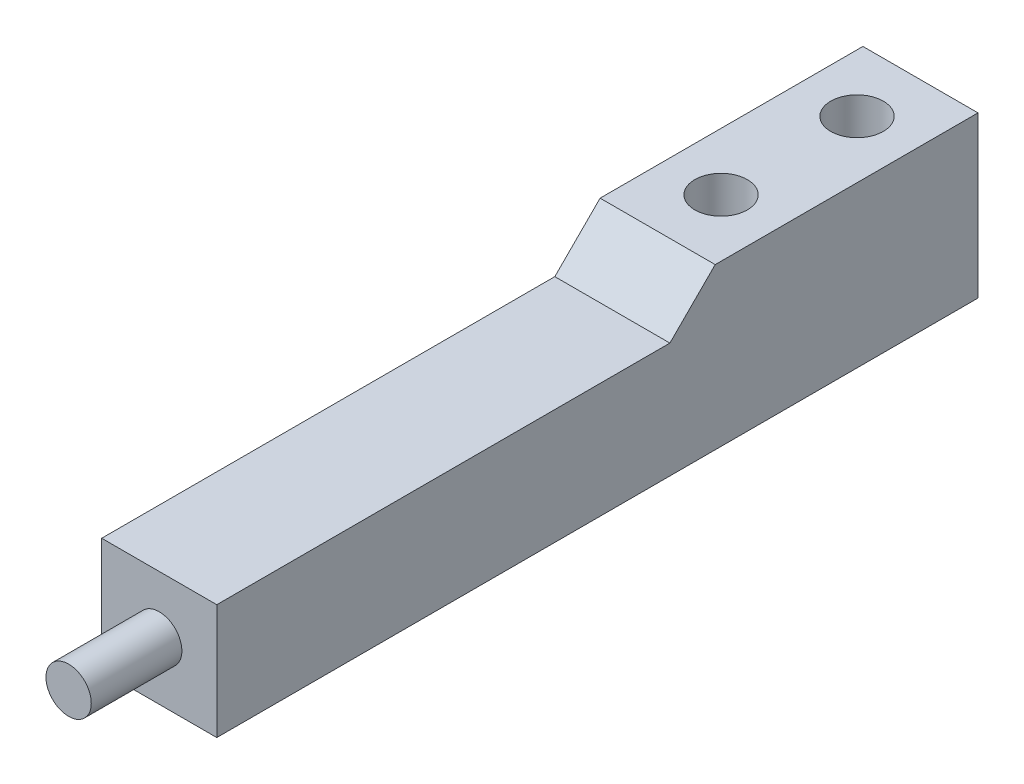
ISO-10303-21;
HEADER;
FILE_DESCRIPTION(('STEP AP214'),'2;1');
FILE_NAME('part.step','',(''),(''),'','','');
FILE_SCHEMA(('AUTOMOTIVE_DESIGN { 1 0 10303 214 1 1 1 1 }'));
ENDSEC;
DATA;
#1=APPLICATION_CONTEXT('core data for automotive mechanical design processes');
#2=APPLICATION_PROTOCOL_DEFINITION('international standard','automotive_design',2000,#1);
#3=PRODUCT_CONTEXT('',#1,'mechanical');
#4=PRODUCT('Part','Part','',(#3));
#5=PRODUCT_RELATED_PRODUCT_CATEGORY('part','',(#4));
#6=PRODUCT_DEFINITION_FORMATION('','',#4);
#7=PRODUCT_DEFINITION_CONTEXT('part definition',#1,'design');
#8=PRODUCT_DEFINITION('design','',#6,#7);
#9=PRODUCT_DEFINITION_SHAPE('','',#8);
#10=(LENGTH_UNIT() NAMED_UNIT(*) SI_UNIT(.MILLI.,.METRE.));
#11=(NAMED_UNIT(*) PLANE_ANGLE_UNIT() SI_UNIT($,.RADIAN.));
#12=(NAMED_UNIT(*) SI_UNIT($,.STERADIAN.) SOLID_ANGLE_UNIT());
#13=UNCERTAINTY_MEASURE_WITH_UNIT(LENGTH_MEASURE(1.E-05),#10,'distance_accuracy_value','');
#14=(GEOMETRIC_REPRESENTATION_CONTEXT(3) GLOBAL_UNCERTAINTY_ASSIGNED_CONTEXT((#13)) GLOBAL_UNIT_ASSIGNED_CONTEXT((#10,
#11,#12)) REPRESENTATION_CONTEXT('',''));
#15=CARTESIAN_POINT('',(0.,0.,0.));
#16=DIRECTION('',(0.,0.,1.));
#17=DIRECTION('',(1.,0.,0.));
#18=AXIS2_PLACEMENT_3D('',#15,#16,#17);
#19=CARTESIAN_POINT('',(0.,12.7,0.));
#20=DIRECTION('',(0.,-1.,0.));
#21=DIRECTION('',(0.,0.,-1.));
#22=AXIS2_PLACEMENT_3D('',#19,#20,#21);
#23=PLANE('',#22);
#24=DIRECTION('',(0.,0.,-1.));
#25=VECTOR('',#24,1.);
#26=CARTESIAN_POINT('',(6.35,12.7,42.));
#27=LINE('',#26,#25);
#28=CARTESIAN_POINT('',(6.35,12.7,42.));
#29=VERTEX_POINT('',#28);
#30=CARTESIAN_POINT('',(6.35,12.7,-7.99999999999999));
#31=VERTEX_POINT('',#30);
#32=EDGE_CURVE('E131',#29,#31,#27,.T.);
#33=ORIENTED_EDGE('',*,*,#32,.T.);
#34=DIRECTION('',(-1.,0.,0.));
#35=VECTOR('',#34,1.);
#36=CARTESIAN_POINT('',(-6.35,12.7,-8.));
#37=LINE('',#36,#35);
#38=CARTESIAN_POINT('',(-6.35,12.7,-7.99999999999999));
#39=VERTEX_POINT('',#38);
#40=EDGE_CURVE('E69',#31,#39,#37,.T.);
#41=ORIENTED_EDGE('',*,*,#40,.T.);
#42=DIRECTION('',(0.,0.,1.));
#43=VECTOR('',#42,1.);
#44=CARTESIAN_POINT('',(-6.35,12.7,42.));
#45=LINE('',#44,#43);
#46=CARTESIAN_POINT('',(-6.35,12.7,42.));
#47=VERTEX_POINT('',#46);
#48=EDGE_CURVE('E106',#39,#47,#45,.T.);
#49=ORIENTED_EDGE('',*,*,#48,.T.);
#50=DIRECTION('',(1.,0.,0.));
#51=VECTOR('',#50,1.);
#52=CARTESIAN_POINT('',(-6.35,12.7,42.));
#53=LINE('',#52,#51);
#54=EDGE_CURVE('E137',#47,#29,#53,.T.);
#55=ORIENTED_EDGE('',*,*,#54,.T.);
#56=EDGE_LOOP('',(#33,#41,#49,#55));
#57=FACE_BOUND('',#56,.T.);
#58=ADVANCED_FACE('F44',(#57),#23,.F.);
#59=CARTESIAN_POINT('',(6.35,12.7,42.));
#60=DIRECTION('',(-1.,0.,0.));
#61=DIRECTION('',(0.,0.,1.));
#62=AXIS2_PLACEMENT_3D('',#59,#60,#61);
#63=PLANE('',#62);
#64=DIRECTION('',(0.,0.,-1.));
#65=VECTOR('',#64,1.);
#66=CARTESIAN_POINT('',(6.35,0.,42.));
#67=LINE('',#66,#65);
#68=CARTESIAN_POINT('',(6.35,0.,42.));
#69=VERTEX_POINT('',#68);
#70=CARTESIAN_POINT('',(6.35,0.,-42.));
#71=VERTEX_POINT('',#70);
#72=EDGE_CURVE('E130',#69,#71,#67,.T.);
#73=ORIENTED_EDGE('',*,*,#72,.T.);
#74=DIRECTION('',(0.,-1.,0.));
#75=VECTOR('',#74,1.);
#76=CARTESIAN_POINT('',(6.35,12.7,-42.));
#77=LINE('',#76,#75);
#78=CARTESIAN_POINT('',(6.34999999999994,17.7,-42.));
#79=VERTEX_POINT('',#78);
#80=EDGE_CURVE('E162',#79,#71,#77,.T.);
#81=ORIENTED_EDGE('',*,*,#80,.F.);
#82=DIRECTION('',(0.,0.,-1.));
#83=VECTOR('',#82,1.);
#84=CARTESIAN_POINT('',(6.34999999999994,17.7,-42.));
#85=LINE('',#84,#83);
#86=CARTESIAN_POINT('',(6.35000000000006,17.7,-13.));
#87=VERTEX_POINT('',#86);
#88=EDGE_CURVE('E122',#87,#79,#85,.T.);
#89=ORIENTED_EDGE('',*,*,#88,.F.);
#90=DIRECTION('',(0.,0.70710678118655,-0.707106781186545));
#91=VECTOR('',#90,1.);
#92=CARTESIAN_POINT('',(6.35,-12.3,16.9999999999998));
#93=LINE('',#92,#91);
#94=EDGE_CURVE('E62',#87,#31,#93,.F.);
#95=ORIENTED_EDGE('',*,*,#94,.T.);
#96=ORIENTED_EDGE('',*,*,#32,.F.);
#97=DIRECTION('',(0.,-1.,0.));
#98=VECTOR('',#97,1.);
#99=CARTESIAN_POINT('',(6.35,12.7,42.));
#100=LINE('',#99,#98);
#101=EDGE_CURVE('E140',#29,#69,#100,.T.);
#102=ORIENTED_EDGE('',*,*,#101,.T.);
#103=EDGE_LOOP('',(#73,#81,#89,#95,#96,#102));
#104=FACE_BOUND('',#103,.T.);
#105=ADVANCED_FACE('F171',(#104),#63,.F.);
#106=CARTESIAN_POINT('',(-6.35,12.7,-42.));
#107=DIRECTION('',(0.,0.,1.));
#108=DIRECTION('',(1.,0.,0.));
#109=AXIS2_PLACEMENT_3D('',#106,#107,#108);
#110=PLANE('',#109);
#111=DIRECTION('',(-1.,0.,0.));
#112=VECTOR('',#111,1.);
#113=CARTESIAN_POINT('',(-6.35,0.,-42.));
#114=LINE('',#113,#112);
#115=CARTESIAN_POINT('',(-6.35,0.,-42.));
#116=VERTEX_POINT('',#115);
#117=EDGE_CURVE('E144',#71,#116,#114,.T.);
#118=ORIENTED_EDGE('',*,*,#117,.T.);
#119=DIRECTION('',(0.,-1.,0.));
#120=VECTOR('',#119,1.);
#121=CARTESIAN_POINT('',(-6.35,12.7,-42.));
#122=LINE('',#121,#120);
#123=CARTESIAN_POINT('',(-6.34999999999994,17.7,-42.));
#124=VERTEX_POINT('',#123);
#125=EDGE_CURVE('E159',#124,#116,#122,.T.);
#126=ORIENTED_EDGE('',*,*,#125,.F.);
#127=DIRECTION('',(-1.,0.,0.));
#128=VECTOR('',#127,1.);
#129=CARTESIAN_POINT('',(-6.34999999999994,17.7,-42.));
#130=LINE('',#129,#128);
#131=EDGE_CURVE('E117',#79,#124,#130,.T.);
#132=ORIENTED_EDGE('',*,*,#131,.F.);
#133=ORIENTED_EDGE('',*,*,#80,.T.);
#134=EDGE_LOOP('',(#118,#126,#132,#133));
#135=FACE_BOUND('',#134,.T.);
#136=ADVANCED_FACE('F169',(#135),#110,.F.);
#137=CARTESIAN_POINT('',(-6.35,12.7,42.));
#138=DIRECTION('',(1.,0.,0.));
#139=DIRECTION('',(0.,0.,-1.));
#140=AXIS2_PLACEMENT_3D('',#137,#138,#139);
#141=PLANE('',#140);
#142=DIRECTION('',(0.,0.,1.));
#143=VECTOR('',#142,1.);
#144=CARTESIAN_POINT('',(-6.35,0.,42.));
#145=LINE('',#144,#143);
#146=CARTESIAN_POINT('',(-6.35,0.,42.));
#147=VERTEX_POINT('',#146);
#148=EDGE_CURVE('E147',#116,#147,#145,.T.);
#149=ORIENTED_EDGE('',*,*,#148,.T.);
#150=DIRECTION('',(0.,-1.,0.));
#151=VECTOR('',#150,1.);
#152=CARTESIAN_POINT('',(-6.35,12.7,42.));
#153=LINE('',#152,#151);
#154=EDGE_CURVE('E155',#47,#147,#153,.T.);
#155=ORIENTED_EDGE('',*,*,#154,.F.);
#156=ORIENTED_EDGE('',*,*,#48,.F.);
#157=DIRECTION('',(0.,-0.70710678118655,0.707106781186545));
#158=VECTOR('',#157,1.);
#159=CARTESIAN_POINT('',(-6.35,-12.3,16.9999999999998));
#160=LINE('',#159,#158);
#161=CARTESIAN_POINT('',(-6.34999999999994,17.7,-13.));
#162=VERTEX_POINT('',#161);
#163=EDGE_CURVE('E49',#39,#162,#160,.F.);
#164=ORIENTED_EDGE('',*,*,#163,.T.);
#165=DIRECTION('',(0.,0.,1.));
#166=VECTOR('',#165,1.);
#167=CARTESIAN_POINT('',(-6.34999999999994,17.7,-42.));
#168=LINE('',#167,#166);
#169=EDGE_CURVE('E104',#124,#162,#168,.T.);
#170=ORIENTED_EDGE('',*,*,#169,.F.);
#171=ORIENTED_EDGE('',*,*,#125,.T.);
#172=EDGE_LOOP('',(#149,#155,#156,#164,#170,#171));
#173=FACE_BOUND('',#172,.T.);
#174=ADVANCED_FACE('F102',(#173),#141,.F.);
#175=CARTESIAN_POINT('',(-6.35,12.7,42.));
#176=DIRECTION('',(0.,0.,-1.));
#177=DIRECTION('',(-1.,0.,0.));
#178=AXIS2_PLACEMENT_3D('',#175,#176,#177);
#179=PLANE('',#178);
#180=CARTESIAN_POINT('',(0.,6.35,42.));
#181=DIRECTION('',(0.,0.,1.));
#182=DIRECTION('',(1.,0.,0.));
#183=AXIS2_PLACEMENT_3D('',#180,#181,#182);
#184=CIRCLE('',#183,2.5);
#185=CARTESIAN_POINT('',(2.5,6.35,42.));
#186=VERTEX_POINT('',#185);
#187=EDGE_CURVE('E11',#186,#186,#184,.T.);
#188=ORIENTED_EDGE('',*,*,#187,.F.);
#189=EDGE_LOOP('',(#188));
#190=FACE_BOUND('',#189,.T.);
#191=DIRECTION('',(1.,0.,0.));
#192=VECTOR('',#191,1.);
#193=CARTESIAN_POINT('',(-6.35,0.,42.));
#194=LINE('',#193,#192);
#195=EDGE_CURVE('E134',#147,#69,#194,.T.);
#196=ORIENTED_EDGE('',*,*,#195,.T.);
#197=ORIENTED_EDGE('',*,*,#101,.F.);
#198=ORIENTED_EDGE('',*,*,#54,.F.);
#199=ORIENTED_EDGE('',*,*,#154,.T.);
#200=EDGE_LOOP('',(#196,#197,#198,#199));
#201=FACE_BOUND('',#200,.T.);
#202=ADVANCED_FACE('F179',(#190,#201),#179,.F.);
#203=CARTESIAN_POINT('',(0.,0.,0.));
#204=DIRECTION('',(0.,-1.,0.));
#205=DIRECTION('',(0.,0.,-1.));
#206=AXIS2_PLACEMENT_3D('',#203,#204,#205);
#207=PLANE('',#206);
#208=CARTESIAN_POINT('',(0.,0.,-35.));
#209=DIRECTION('',(0.,-1.,0.));
#210=DIRECTION('',(0.,0.,-1.));
#211=AXIS2_PLACEMENT_3D('',#208,#209,#210);
#212=CIRCLE('',#211,5.025);
#213=CARTESIAN_POINT('',(0.,0.,-40.025));
#214=VERTEX_POINT('',#213);
#215=EDGE_CURVE('E394',#214,#214,#212,.T.);
#216=ORIENTED_EDGE('',*,*,#215,.F.);
#217=EDGE_LOOP('',(#216));
#218=FACE_BOUND('',#217,.T.);
#219=CARTESIAN_POINT('',(0.,0.,-20.));
#220=DIRECTION('',(0.,-1.,0.));
#221=DIRECTION('',(0.,0.,-1.));
#222=AXIS2_PLACEMENT_3D('',#219,#220,#221);
#223=CIRCLE('',#222,5.025);
#224=CARTESIAN_POINT('',(0.,0.,-25.025));
#225=VERTEX_POINT('',#224);
#226=EDGE_CURVE('E416',#225,#225,#223,.T.);
#227=ORIENTED_EDGE('',*,*,#226,.F.);
#228=EDGE_LOOP('',(#227));
#229=FACE_BOUND('',#228,.T.);
#230=ORIENTED_EDGE('',*,*,#72,.F.);
#231=ORIENTED_EDGE('',*,*,#195,.F.);
#232=ORIENTED_EDGE('',*,*,#148,.F.);
#233=ORIENTED_EDGE('',*,*,#117,.F.);
#234=EDGE_LOOP('',(#230,#231,#232,#233));
#235=FACE_BOUND('',#234,.T.);
#236=ADVANCED_FACE('F175',(#218,#229,#235),#207,.T.);
#237=CARTESIAN_POINT('',(0.,17.7,0.));
#238=DIRECTION('',(0.,1.,0.));
#239=DIRECTION('',(0.,0.,1.));
#240=AXIS2_PLACEMENT_3D('',#237,#238,#239);
#241=PLANE('',#240);
#242=CARTESIAN_POINT('',(0.,17.7,-35.));
#243=DIRECTION('',(0.,-1.,0.));
#244=DIRECTION('',(0.,0.,-1.));
#245=AXIS2_PLACEMENT_3D('',#242,#243,#244);
#246=CIRCLE('',#245,2.9);
#247=CARTESIAN_POINT('',(0.,17.7,-37.9));
#248=VERTEX_POINT('',#247);
#249=EDGE_CURVE('E412',#248,#248,#246,.T.);
#250=ORIENTED_EDGE('',*,*,#249,.T.);
#251=EDGE_LOOP('',(#250));
#252=FACE_BOUND('',#251,.T.);
#253=CARTESIAN_POINT('',(0.,17.7,-20.));
#254=DIRECTION('',(0.,-1.,0.));
#255=DIRECTION('',(0.,0.,-1.));
#256=AXIS2_PLACEMENT_3D('',#253,#254,#255);
#257=CIRCLE('',#256,2.9);
#258=CARTESIAN_POINT('',(0.,17.7,-22.9));
#259=VERTEX_POINT('',#258);
#260=EDGE_CURVE('E119',#259,#259,#257,.T.);
#261=ORIENTED_EDGE('',*,*,#260,.T.);
#262=EDGE_LOOP('',(#261));
#263=FACE_BOUND('',#262,.T.);
#264=ORIENTED_EDGE('',*,*,#169,.T.);
#265=DIRECTION('',(1.,0.,0.));
#266=VECTOR('',#265,1.);
#267=CARTESIAN_POINT('',(-6.34999999999994,17.7,-13.));
#268=LINE('',#267,#266);
#269=EDGE_CURVE('E115',#162,#87,#268,.T.);
#270=ORIENTED_EDGE('',*,*,#269,.T.);
#271=ORIENTED_EDGE('',*,*,#88,.T.);
#272=ORIENTED_EDGE('',*,*,#131,.T.);
#273=EDGE_LOOP('',(#264,#270,#271,#272));
#274=FACE_BOUND('',#273,.T.);
#275=ADVANCED_FACE('F113',(#252,#263,#274),#241,.T.);
#276=CARTESIAN_POINT('',(0.,0.,-20.));
#277=DIRECTION('',(0.,-1.,0.));
#278=DIRECTION('',(0.,0.,-1.));
#279=AXIS2_PLACEMENT_3D('',#276,#277,#278);
#280=CYLINDRICAL_SURFACE('',#279,2.9);
#281=ORIENTED_EDGE('',*,*,#260,.F.);
#282=EDGE_LOOP('',(#281));
#283=FACE_BOUND('',#282,.T.);
#284=CARTESIAN_POINT('',(0.,5.,-20.));
#285=DIRECTION('',(0.,-1.,0.));
#286=DIRECTION('',(0.,0.,-1.));
#287=AXIS2_PLACEMENT_3D('',#284,#285,#286);
#288=CIRCLE('',#287,2.9);
#289=CARTESIAN_POINT('',(0.,5.,-22.9));
#290=VERTEX_POINT('',#289);
#291=EDGE_CURVE('E428',#290,#290,#288,.T.);
#292=ORIENTED_EDGE('',*,*,#291,.T.);
#293=EDGE_LOOP('',(#292));
#294=FACE_BOUND('',#293,.T.);
#295=ADVANCED_FACE('F222',(#283,#294),#280,.F.);
#296=CARTESIAN_POINT('',(5.,5.,-20.));
#297=DIRECTION('',(0.,1.,0.));
#298=DIRECTION('',(0.,0.,1.));
#299=AXIS2_PLACEMENT_3D('',#296,#297,#298);
#300=PLANE('',#299);
#301=ORIENTED_EDGE('',*,*,#291,.F.);
#302=EDGE_LOOP('',(#301));
#303=FACE_BOUND('',#302,.T.);
#304=CARTESIAN_POINT('',(0.,5.,-20.));
#305=DIRECTION('',(0.,-1.,0.));
#306=DIRECTION('',(0.,0.,-1.));
#307=AXIS2_PLACEMENT_3D('',#304,#305,#306);
#308=CIRCLE('',#307,5.);
#309=CARTESIAN_POINT('',(0.,5.,-25.));
#310=VERTEX_POINT('',#309);
#311=EDGE_CURVE('E424',#310,#310,#308,.T.);
#312=ORIENTED_EDGE('',*,*,#311,.T.);
#313=EDGE_LOOP('',(#312));
#314=FACE_BOUND('',#313,.T.);
#315=ADVANCED_FACE('F228',(#303,#314),#300,.F.);
#316=CARTESIAN_POINT('',(0.,0.,-20.));
#317=DIRECTION('',(0.,-1.,0.));
#318=DIRECTION('',(0.,0.,-1.));
#319=AXIS2_PLACEMENT_3D('',#316,#317,#318);
#320=CYLINDRICAL_SURFACE('',#319,5.);
#321=ORIENTED_EDGE('',*,*,#311,.F.);
#322=EDGE_LOOP('',(#321));
#323=FACE_BOUND('',#322,.T.);
#324=CARTESIAN_POINT('',(0.,0.0209774907794336,-20.));
#325=DIRECTION('',(0.,-1.,0.));
#326=DIRECTION('',(0.,0.,-1.));
#327=AXIS2_PLACEMENT_3D('',#324,#325,#326);
#328=CIRCLE('',#327,5.);
#329=CARTESIAN_POINT('',(0.,0.0209774907794336,-25.));
#330=VERTEX_POINT('',#329);
#331=EDGE_CURVE('E420',#330,#330,#328,.T.);
#332=ORIENTED_EDGE('',*,*,#331,.T.);
#333=EDGE_LOOP('',(#332));
#334=FACE_BOUND('',#333,.T.);
#335=ADVANCED_FACE('F235',(#323,#334),#320,.F.);
#336=CARTESIAN_POINT('',(0.,0.,-20.));
#337=DIRECTION('',(0.,-1.,0.));
#338=DIRECTION('',(0.,0.,-1.));
#339=AXIS2_PLACEMENT_3D('',#336,#337,#338);
#340=CONICAL_SURFACE('',#339,5.025,0.872664625997159);
#341=ORIENTED_EDGE('',*,*,#331,.F.);
#342=EDGE_LOOP('',(#341));
#343=FACE_BOUND('',#342,.T.);
#344=ORIENTED_EDGE('',*,*,#226,.T.);
#345=EDGE_LOOP('',(#344));
#346=FACE_BOUND('',#345,.T.);
#347=ADVANCED_FACE('F243',(#343,#346),#340,.F.);
#348=CARTESIAN_POINT('',(0.,0.,-35.));
#349=DIRECTION('',(0.,-1.,0.));
#350=DIRECTION('',(0.,0.,-1.));
#351=AXIS2_PLACEMENT_3D('',#348,#349,#350);
#352=CYLINDRICAL_SURFACE('',#351,2.9);
#353=ORIENTED_EDGE('',*,*,#249,.F.);
#354=EDGE_LOOP('',(#353));
#355=FACE_BOUND('',#354,.T.);
#356=CARTESIAN_POINT('',(0.,5.,-35.));
#357=DIRECTION('',(0.,-1.,0.));
#358=DIRECTION('',(0.,0.,-1.));
#359=AXIS2_PLACEMENT_3D('',#356,#357,#358);
#360=CIRCLE('',#359,2.9);
#361=CARTESIAN_POINT('',(0.,5.,-37.9));
#362=VERTEX_POINT('',#361);
#363=EDGE_CURVE('E408',#362,#362,#360,.T.);
#364=ORIENTED_EDGE('',*,*,#363,.T.);
#365=EDGE_LOOP('',(#364));
#366=FACE_BOUND('',#365,.T.);
#367=ADVANCED_FACE('F251',(#355,#366),#352,.F.);
#368=CARTESIAN_POINT('',(5.,5.,-35.));
#369=DIRECTION('',(0.,1.,0.));
#370=DIRECTION('',(0.,0.,1.));
#371=AXIS2_PLACEMENT_3D('',#368,#369,#370);
#372=PLANE('',#371);
#373=ORIENTED_EDGE('',*,*,#363,.F.);
#374=EDGE_LOOP('',(#373));
#375=FACE_BOUND('',#374,.T.);
#376=CARTESIAN_POINT('',(0.,5.,-35.));
#377=DIRECTION('',(0.,-1.,0.));
#378=DIRECTION('',(0.,0.,-1.));
#379=AXIS2_PLACEMENT_3D('',#376,#377,#378);
#380=CIRCLE('',#379,5.);
#381=CARTESIAN_POINT('',(0.,5.,-40.));
#382=VERTEX_POINT('',#381);
#383=EDGE_CURVE('E404',#382,#382,#380,.T.);
#384=ORIENTED_EDGE('',*,*,#383,.T.);
#385=EDGE_LOOP('',(#384));
#386=FACE_BOUND('',#385,.T.);
#387=ADVANCED_FACE('F259',(#375,#386),#372,.F.);
#388=CARTESIAN_POINT('',(0.,0.,-35.));
#389=DIRECTION('',(0.,-1.,0.));
#390=DIRECTION('',(0.,0.,-1.));
#391=AXIS2_PLACEMENT_3D('',#388,#389,#390);
#392=CYLINDRICAL_SURFACE('',#391,5.);
#393=ORIENTED_EDGE('',*,*,#383,.F.);
#394=EDGE_LOOP('',(#393));
#395=FACE_BOUND('',#394,.T.);
#396=CARTESIAN_POINT('',(0.,0.0209774907794336,-35.));
#397=DIRECTION('',(0.,-1.,0.));
#398=DIRECTION('',(0.,0.,-1.));
#399=AXIS2_PLACEMENT_3D('',#396,#397,#398);
#400=CIRCLE('',#399,5.);
#401=CARTESIAN_POINT('',(0.,0.0209774907794336,-40.));
#402=VERTEX_POINT('',#401);
#403=EDGE_CURVE('E398',#402,#402,#400,.T.);
#404=ORIENTED_EDGE('',*,*,#403,.T.);
#405=EDGE_LOOP('',(#404));
#406=FACE_BOUND('',#405,.T.);
#407=ADVANCED_FACE('F267',(#395,#406),#392,.F.);
#408=CARTESIAN_POINT('',(0.,0.,-35.));
#409=DIRECTION('',(0.,-1.,0.));
#410=DIRECTION('',(0.,0.,-1.));
#411=AXIS2_PLACEMENT_3D('',#408,#409,#410);
#412=CONICAL_SURFACE('',#411,5.025,0.872664625997159);
#413=ORIENTED_EDGE('',*,*,#403,.F.);
#414=EDGE_LOOP('',(#413));
#415=FACE_BOUND('',#414,.T.);
#416=ORIENTED_EDGE('',*,*,#215,.T.);
#417=EDGE_LOOP('',(#416));
#418=FACE_BOUND('',#417,.T.);
#419=ADVANCED_FACE('F275',(#415,#418),#412,.F.);
#420=CARTESIAN_POINT('',(-6.34999999999994,17.7,-13.));
#421=DIRECTION('',(0.,0.707106781186545,0.707106781186551));
#422=DIRECTION('',(-1.,0.,0.));
#423=AXIS2_PLACEMENT_3D('',#420,#421,#422);
#424=PLANE('',#423);
#425=ORIENTED_EDGE('',*,*,#163,.F.);
#426=ORIENTED_EDGE('',*,*,#40,.F.);
#427=ORIENTED_EDGE('',*,*,#94,.F.);
#428=ORIENTED_EDGE('',*,*,#269,.F.);
#429=EDGE_LOOP('',(#425,#426,#427,#428));
#430=FACE_BOUND('',#429,.T.);
#431=ADVANCED_FACE('F47',(#430),#424,.T.);
#432=CARTESIAN_POINT('',(0.,6.35,52.));
#433=DIRECTION('',(0.,0.,-1.));
#434=DIRECTION('',(-1.,0.,0.));
#435=AXIS2_PLACEMENT_3D('',#432,#433,#434);
#436=CYLINDRICAL_SURFACE('',#435,2.5);
#437=CARTESIAN_POINT('',(0.,6.35,52.));
#438=DIRECTION('',(0.,0.,1.));
#439=DIRECTION('',(1.,0.,0.));
#440=AXIS2_PLACEMENT_3D('',#437,#438,#439);
#441=CIRCLE('',#440,2.5);
#442=CARTESIAN_POINT('',(2.5,6.35,52.));
#443=VERTEX_POINT('',#442);
#444=EDGE_CURVE('E392',#443,#443,#441,.T.);
#445=ORIENTED_EDGE('',*,*,#444,.F.);
#446=EDGE_LOOP('',(#445));
#447=FACE_BOUND('',#446,.T.);
#448=ORIENTED_EDGE('',*,*,#187,.T.);
#449=EDGE_LOOP('',(#448));
#450=FACE_BOUND('',#449,.T.);
#451=ADVANCED_FACE('F289',(#447,#450),#436,.T.);
#452=CARTESIAN_POINT('',(0.,6.35,52.));
#453=DIRECTION('',(0.,0.,1.));
#454=DIRECTION('',(1.,0.,0.));
#455=AXIS2_PLACEMENT_3D('',#452,#453,#454);
#456=PLANE('',#455);
#457=ORIENTED_EDGE('',*,*,#444,.T.);
#458=EDGE_LOOP('',(#457));
#459=FACE_BOUND('',#458,.T.);
#460=ADVANCED_FACE('F294',(#459),#456,.T.);
#461=CLOSED_SHELL('',(#58,#105,#136,#174,#202,#236,#275,#295,#315,#335,#347,#367,#387,#407,#419,
#431,#451,#460));
#462=MANIFOLD_SOLID_BREP('B2',#461);
#463=ADVANCED_BREP_SHAPE_REPRESENTATION('',(#18,#462),#14);
#464=SHAPE_DEFINITION_REPRESENTATION(#9,#463);
ENDSEC;
END-ISO-10303-21;
